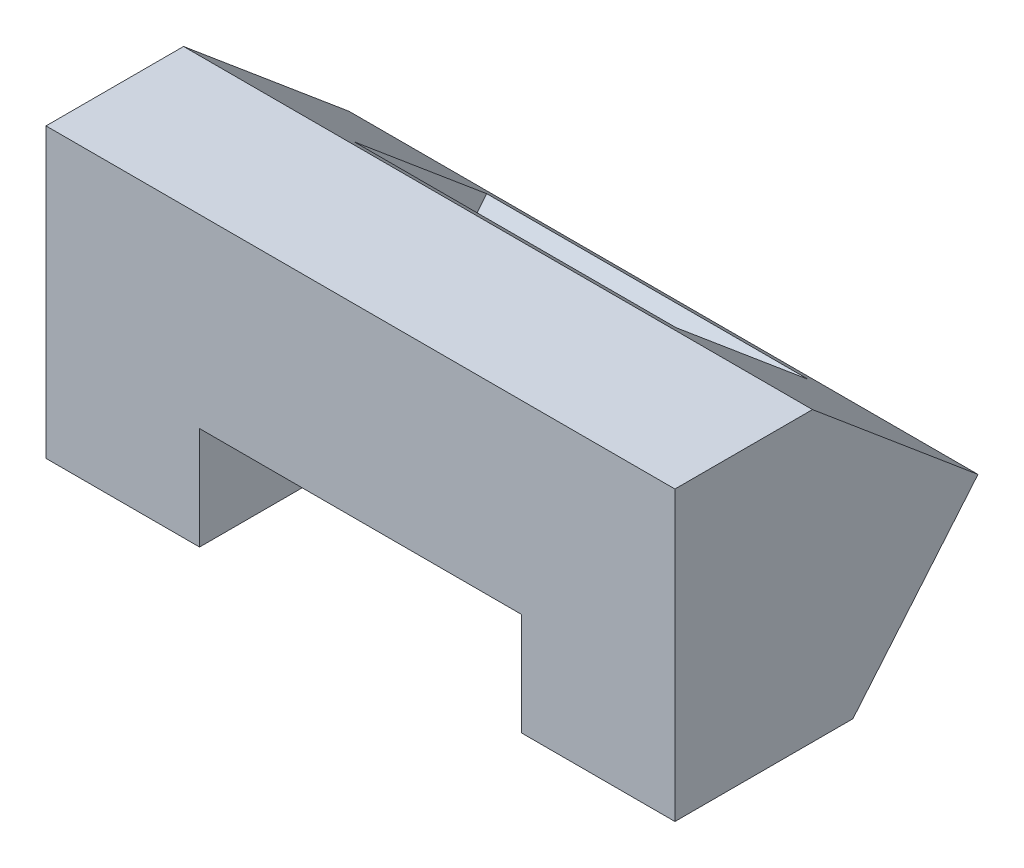
ISO-10303-21;
HEADER;
FILE_DESCRIPTION(('STEP AP214'),'2;1');
FILE_NAME('part.step','',(''),(''),'','','');
FILE_SCHEMA(('AUTOMOTIVE_DESIGN { 1 0 10303 214 1 1 1 1 }'));
ENDSEC;
DATA;
#1=APPLICATION_CONTEXT('core data for automotive mechanical design processes');
#2=APPLICATION_PROTOCOL_DEFINITION('international standard','automotive_design',2000,#1);
#3=PRODUCT_CONTEXT('',#1,'mechanical');
#4=PRODUCT('Part','Part','',(#3));
#5=PRODUCT_RELATED_PRODUCT_CATEGORY('part','',(#4));
#6=PRODUCT_DEFINITION_FORMATION('','',#4);
#7=PRODUCT_DEFINITION_CONTEXT('part definition',#1,'design');
#8=PRODUCT_DEFINITION('design','',#6,#7);
#9=PRODUCT_DEFINITION_SHAPE('','',#8);
#10=(LENGTH_UNIT() NAMED_UNIT(*) SI_UNIT(.MILLI.,.METRE.));
#11=(NAMED_UNIT(*) PLANE_ANGLE_UNIT() SI_UNIT($,.RADIAN.));
#12=(NAMED_UNIT(*) SI_UNIT($,.STERADIAN.) SOLID_ANGLE_UNIT());
#13=UNCERTAINTY_MEASURE_WITH_UNIT(LENGTH_MEASURE(1.E-05),#10,'distance_accuracy_value','');
#14=(GEOMETRIC_REPRESENTATION_CONTEXT(3) GLOBAL_UNCERTAINTY_ASSIGNED_CONTEXT((#13)) GLOBAL_UNIT_ASSIGNED_CONTEXT((#10,
#11,#12)) REPRESENTATION_CONTEXT('',''));
#15=CARTESIAN_POINT('',(0.,0.,0.));
#16=DIRECTION('',(0.,0.,1.));
#17=DIRECTION('',(1.,0.,0.));
#18=AXIS2_PLACEMENT_3D('',#15,#16,#17);
#19=CARTESIAN_POINT('',(0.,-125.337063400701,105.170283672372));
#20=DIRECTION('',(0.,0.766044443118977,-0.642787609686541));
#21=DIRECTION('',(0.,0.642787609686541,0.766044443118977));
#22=AXIS2_PLACEMENT_3D('',#19,#20,#21);
#23=PLANE('',#22);
#24=DIRECTION('',(-1.,0.,0.));
#25=VECTOR('',#24,1.);
#26=CARTESIAN_POINT('',(15.0384797227754,-227.995738018972,-17.1735606149134));
#27=LINE('',#26,#25);
#28=CARTESIAN_POINT('',(6.6,-227.995738018972,-17.1735606149134));
#29=VERTEX_POINT('',#28);
#30=CARTESIAN_POINT('',(-6.6,-227.995738018972,-17.1735606149134));
#31=VERTEX_POINT('',#30);
#32=EDGE_CURVE('E223',#29,#31,#27,.T.);
#33=ORIENTED_EDGE('',*,*,#32,.T.);
#34=DIRECTION('',(0.,-0.642787609686541,-0.766044443118977));
#35=VECTOR('',#34,1.);
#36=CARTESIAN_POINT('',(-6.6,-227.031556604443,-16.024493950235));
#37=LINE('',#36,#35);
#38=CARTESIAN_POINT('',(-6.6,-227.031556604443,-16.024493950235));
#39=VERTEX_POINT('',#38);
#40=EDGE_CURVE('E186',#39,#31,#37,.T.);
#41=ORIENTED_EDGE('',*,*,#40,.F.);
#42=DIRECTION('',(1.,0.,0.));
#43=VECTOR('',#42,1.);
#44=CARTESIAN_POINT('',(6.6,-227.031556604443,-16.024493950235));
#45=LINE('',#44,#43);
#46=CARTESIAN_POINT('',(6.6,-227.031556604443,-16.024493950235));
#47=VERTEX_POINT('',#46);
#48=EDGE_CURVE('E243',#39,#47,#45,.T.);
#49=ORIENTED_EDGE('',*,*,#48,.T.);
#50=DIRECTION('',(0.,-0.642787609686541,-0.766044443118977));
#51=VECTOR('',#50,1.);
#52=CARTESIAN_POINT('',(6.6,-227.031556604443,-16.024493950235));
#53=LINE('',#52,#51);
#54=EDGE_CURVE('E237',#47,#29,#53,.T.);
#55=ORIENTED_EDGE('',*,*,#54,.T.);
#56=EDGE_LOOP('',(#33,#41,#49,#55));
#57=FACE_BOUND('',#56,.T.);
#58=ADVANCED_FACE('F41',(#57),#23,.T.);
#59=CARTESIAN_POINT('',(12.9,-221.441619494967,-19.4748711922345));
#60=DIRECTION('',(1.,0.,0.));
#61=DIRECTION('',(0.,0.,-1.));
#62=AXIS2_PLACEMENT_3D('',#59,#60,#61);
#63=PLANE('',#62);
#64=DIRECTION('',(0.,-0.766044443118984,0.642787609686532));
#65=VECTOR('',#64,1.);
#66=CARTESIAN_POINT('',(12.9,-227.239033665489,-26.2283879750248));
#67=LINE('',#66,#65);
#68=CARTESIAN_POINT('',(12.9,-227.239033665489,-26.2283879750248));
#69=VERTEX_POINT('',#68);
#70=CARTESIAN_POINT('',(12.9,-233.355049167522,-21.0964416229947));
#71=VERTEX_POINT('',#70);
#72=EDGE_CURVE('E256',#69,#71,#67,.T.);
#73=ORIENTED_EDGE('',*,*,#72,.F.);
#74=DIRECTION('',(0.,-0.642787609686541,-0.766044443118977));
#75=VECTOR('',#74,1.);
#76=CARTESIAN_POINT('',(12.9,-221.541619494967,-19.4384741688079));
#77=LINE('',#76,#75);
#78=CARTESIAN_POINT('',(12.9,-221.541619494967,-19.4384741688079));
#79=VERTEX_POINT('',#78);
#80=EDGE_CURVE('E260',#79,#69,#77,.T.);
#81=ORIENTED_EDGE('',*,*,#80,.F.);
#82=DIRECTION('',(0.,0.,-1.));
#83=VECTOR('',#82,1.);
#84=CARTESIAN_POINT('',(12.9,-221.541619494967,-13.7962354342487));
#85=LINE('',#84,#83);
#86=CARTESIAN_POINT('',(12.9,-221.541619494967,-13.7962354342487));
#87=VERTEX_POINT('',#86);
#88=EDGE_CURVE('E264',#87,#79,#85,.T.);
#89=ORIENTED_EDGE('',*,*,#88,.F.);
#90=DIRECTION('',(0.,1.,0.));
#91=VECTOR('',#90,1.);
#92=CARTESIAN_POINT('',(12.9,-233.355049167522,-13.7962354342487));
#93=LINE('',#92,#91);
#94=CARTESIAN_POINT('',(12.9,-233.355049167522,-13.7962354342487));
#95=VERTEX_POINT('',#94);
#96=EDGE_CURVE('E268',#95,#87,#93,.T.);
#97=ORIENTED_EDGE('',*,*,#96,.F.);
#98=DIRECTION('',(0.,0.,1.));
#99=VECTOR('',#98,1.);
#100=CARTESIAN_POINT('',(12.9,-233.355049167522,-21.0964416229947));
#101=LINE('',#100,#99);
#102=EDGE_CURVE('E251',#71,#95,#101,.T.);
#103=ORIENTED_EDGE('',*,*,#102,.F.);
#104=EDGE_LOOP('',(#73,#81,#89,#97,#103));
#105=FACE_BOUND('',#104,.T.);
#106=ADVANCED_FACE('F43',(#105),#63,.T.);
#107=CARTESIAN_POINT('',(30.1497970082891,-233.355049167522,-21.0964416229947));
#108=DIRECTION('',(0.,-1.,0.));
#109=DIRECTION('',(0.,0.,-1.));
#110=AXIS2_PLACEMENT_3D('',#107,#108,#109);
#111=PLANE('',#110);
#112=DIRECTION('',(0.,0.,1.));
#113=VECTOR('',#112,1.);
#114=CARTESIAN_POINT('',(6.6,-233.355049167522,-13.7962354342487));
#115=LINE('',#114,#113);
#116=CARTESIAN_POINT('',(6.6,-233.355049167522,-19.3501614171714));
#117=VERTEX_POINT('',#116);
#118=CARTESIAN_POINT('',(6.6,-233.355049167522,-13.7962354342487));
#119=VERTEX_POINT('',#118);
#120=EDGE_CURVE('E161',#117,#119,#115,.T.);
#121=ORIENTED_EDGE('',*,*,#120,.F.);
#122=DIRECTION('',(-1.,0.,0.));
#123=VECTOR('',#122,1.);
#124=CARTESIAN_POINT('',(15.0384797227754,-233.355049167522,-19.3501614171714));
#125=LINE('',#124,#123);
#126=CARTESIAN_POINT('',(-6.6,-233.355049167522,-19.3501614171714));
#127=VERTEX_POINT('',#126);
#128=EDGE_CURVE('E155',#117,#127,#125,.T.);
#129=ORIENTED_EDGE('',*,*,#128,.T.);
#130=DIRECTION('',(0.,0.,1.));
#131=VECTOR('',#130,1.);
#132=CARTESIAN_POINT('',(-6.6,-233.355049167522,-13.7962354342487));
#133=LINE('',#132,#131);
#134=CARTESIAN_POINT('',(-6.6,-233.355049167522,-13.7962354342487));
#135=VERTEX_POINT('',#134);
#136=EDGE_CURVE('E159',#127,#135,#133,.T.);
#137=ORIENTED_EDGE('',*,*,#136,.T.);
#138=DIRECTION('',(1.,0.,0.));
#139=VECTOR('',#138,1.);
#140=CARTESIAN_POINT('',(-30.1497970082891,-233.355049167522,-13.7962354342487));
#141=LINE('',#140,#139);
#142=CARTESIAN_POINT('',(-12.9,-233.355049167522,-13.7962354342487));
#143=VERTEX_POINT('',#142);
#144=EDGE_CURVE('E203',#143,#135,#141,.T.);
#145=ORIENTED_EDGE('',*,*,#144,.F.);
#146=DIRECTION('',(0.,0.,1.));
#147=VECTOR('',#146,1.);
#148=CARTESIAN_POINT('',(-12.9,-233.355049167522,-21.0964416229947));
#149=LINE('',#148,#147);
#150=CARTESIAN_POINT('',(-12.9,-233.355049167522,-21.0964416229947));
#151=VERTEX_POINT('',#150);
#152=EDGE_CURVE('E198',#151,#143,#149,.T.);
#153=ORIENTED_EDGE('',*,*,#152,.F.);
#154=DIRECTION('',(-1.,0.,0.));
#155=VECTOR('',#154,1.);
#156=CARTESIAN_POINT('',(30.1497970082891,-233.355049167522,-21.0964416229947));
#157=LINE('',#156,#155);
#158=EDGE_CURVE('E49',#71,#151,#157,.T.);
#159=ORIENTED_EDGE('',*,*,#158,.F.);
#160=ORIENTED_EDGE('',*,*,#102,.T.);
#161=DIRECTION('',(-1.,0.,0.));
#162=VECTOR('',#161,1.);
#163=CARTESIAN_POINT('',(30.1497970082891,-233.355049167522,-13.7962354342487));
#164=LINE('',#163,#162);
#165=EDGE_CURVE('E255',#95,#119,#164,.T.);
#166=ORIENTED_EDGE('',*,*,#165,.T.);
#167=EDGE_LOOP('',(#121,#129,#137,#145,#153,#159,#160,#166));
#168=FACE_BOUND('',#167,.T.);
#169=ADVANCED_FACE('F157',(#168),#111,.T.);
#170=CARTESIAN_POINT('',(30.1497970082891,-233.355049167522,-13.7962354342487));
#171=DIRECTION('',(0.,0.,1.));
#172=DIRECTION('',(1.,0.,0.));
#173=AXIS2_PLACEMENT_3D('',#170,#171,#172);
#174=PLANE('',#173);
#175=DIRECTION('',(0.,1.,0.));
#176=VECTOR('',#175,1.);
#177=CARTESIAN_POINT('',(6.6,-229.144804683651,-13.7962354342487));
#178=LINE('',#177,#176);
#179=CARTESIAN_POINT('',(6.6,-229.144804683651,-13.7962354342487));
#180=VERTEX_POINT('',#179);
#181=EDGE_CURVE('E228',#119,#180,#178,.T.);
#182=ORIENTED_EDGE('',*,*,#181,.F.);
#183=ORIENTED_EDGE('',*,*,#165,.F.);
#184=ORIENTED_EDGE('',*,*,#96,.T.);
#185=DIRECTION('',(-1.,0.,0.));
#186=VECTOR('',#185,1.);
#187=CARTESIAN_POINT('',(30.1497970082891,-221.541619494967,-13.7962354342487));
#188=LINE('',#187,#186);
#189=CARTESIAN_POINT('',(-12.9,-221.541619494967,-13.7962354342487));
#190=VERTEX_POINT('',#189);
#191=EDGE_CURVE('E267',#87,#190,#188,.T.);
#192=ORIENTED_EDGE('',*,*,#191,.T.);
#193=DIRECTION('',(0.,1.,0.));
#194=VECTOR('',#193,1.);
#195=CARTESIAN_POINT('',(-12.9,-233.355049167522,-13.7962354342487));
#196=LINE('',#195,#194);
#197=EDGE_CURVE('E213',#143,#190,#196,.T.);
#198=ORIENTED_EDGE('',*,*,#197,.F.);
#199=ORIENTED_EDGE('',*,*,#144,.T.);
#200=DIRECTION('',(0.,1.,0.));
#201=VECTOR('',#200,1.);
#202=CARTESIAN_POINT('',(-6.6,-229.144804683651,-13.7962354342487));
#203=LINE('',#202,#201);
#204=CARTESIAN_POINT('',(-6.6,-229.144804683651,-13.7962354342487));
#205=VERTEX_POINT('',#204);
#206=EDGE_CURVE('E179',#135,#205,#203,.T.);
#207=ORIENTED_EDGE('',*,*,#206,.T.);
#208=DIRECTION('',(-1.,0.,0.));
#209=VECTOR('',#208,1.);
#210=CARTESIAN_POINT('',(15.0384797227754,-229.144804683651,-13.7962354342487));
#211=LINE('',#210,#209);
#212=EDGE_CURVE('E227',#180,#205,#211,.T.);
#213=ORIENTED_EDGE('',*,*,#212,.F.);
#214=EDGE_LOOP('',(#182,#183,#184,#192,#198,#199,#207,#213));
#215=FACE_BOUND('',#214,.T.);
#216=ADVANCED_FACE('F293',(#215),#174,.T.);
#217=CARTESIAN_POINT('',(30.1497970082891,-221.541619494967,-13.7962354342487));
#218=DIRECTION('',(0.,1.,0.));
#219=DIRECTION('',(0.,0.,1.));
#220=AXIS2_PLACEMENT_3D('',#217,#218,#219);
#221=PLANE('',#220);
#222=ORIENTED_EDGE('',*,*,#191,.F.);
#223=ORIENTED_EDGE('',*,*,#88,.T.);
#224=DIRECTION('',(-1.,0.,0.));
#225=VECTOR('',#224,1.);
#226=CARTESIAN_POINT('',(30.1497970082891,-221.541619494967,-19.4384741688079));
#227=LINE('',#226,#225);
#228=CARTESIAN_POINT('',(-12.9,-221.541619494967,-19.4384741688079));
#229=VERTEX_POINT('',#228);
#230=EDGE_CURVE('E263',#79,#229,#227,.T.);
#231=ORIENTED_EDGE('',*,*,#230,.T.);
#232=DIRECTION('',(0.,0.,-1.));
#233=VECTOR('',#232,1.);
#234=CARTESIAN_POINT('',(-12.9,-221.541619494967,-13.7962354342487));
#235=LINE('',#234,#233);
#236=EDGE_CURVE('E210',#190,#229,#235,.T.);
#237=ORIENTED_EDGE('',*,*,#236,.F.);
#238=EDGE_LOOP('',(#222,#223,#231,#237));
#239=FACE_BOUND('',#238,.T.);
#240=ADVANCED_FACE('F352',(#239),#221,.T.);
#241=CARTESIAN_POINT('',(30.1497970082891,-221.541619494967,-19.4384741688079));
#242=DIRECTION('',(0.,0.766044443118977,-0.642787609686541));
#243=DIRECTION('',(0.,0.642787609686541,0.766044443118977));
#244=AXIS2_PLACEMENT_3D('',#241,#242,#243);
#245=PLANE('',#244);
#246=DIRECTION('',(1.,0.,0.));
#247=VECTOR('',#246,1.);
#248=CARTESIAN_POINT('',(30.1497970082891,-222.128872168481,-20.1383346522289));
#249=LINE('',#248,#247);
#250=CARTESIAN_POINT('',(-6.6,-222.128872168481,-20.1383346522288));
#251=VERTEX_POINT('',#250);
#252=CARTESIAN_POINT('',(6.6,-222.128872168481,-20.1383346522288));
#253=VERTEX_POINT('',#252);
#254=EDGE_CURVE('E11',#251,#253,#249,.T.);
#255=ORIENTED_EDGE('',*,*,#254,.F.);
#256=DIRECTION('',(0.,-0.642787609686541,-0.766044443118977));
#257=VECTOR('',#256,1.);
#258=CARTESIAN_POINT('',(-6.6,-222.128872168481,-20.1383346522288));
#259=LINE('',#258,#257);
#260=CARTESIAN_POINT('',(-6.6,-226.692664197256,-25.5772501983736));
#261=VERTEX_POINT('',#260);
#262=EDGE_CURVE('E191',#251,#261,#259,.T.);
#263=ORIENTED_EDGE('',*,*,#262,.T.);
#264=DIRECTION('',(-1.,0.,0.));
#265=VECTOR('',#264,1.);
#266=CARTESIAN_POINT('',(6.6,-226.692664197256,-25.5772501983735));
#267=LINE('',#266,#265);
#268=CARTESIAN_POINT('',(6.6,-226.692664197256,-25.5772501983736));
#269=VERTEX_POINT('',#268);
#270=EDGE_CURVE('E247',#269,#261,#267,.T.);
#271=ORIENTED_EDGE('',*,*,#270,.F.);
#272=DIRECTION('',(0.,-0.642787609686541,-0.766044443118977));
#273=VECTOR('',#272,1.);
#274=CARTESIAN_POINT('',(6.6,-222.128872168481,-20.1383346522288));
#275=LINE('',#274,#273);
#276=EDGE_CURVE('E63',#253,#269,#275,.T.);
#277=ORIENTED_EDGE('',*,*,#276,.F.);
#278=EDGE_LOOP('',(#255,#263,#271,#277));
#279=FACE_BOUND('',#278,.T.);
#280=DIRECTION('',(0.,-0.642787609686541,-0.766044443118977));
#281=VECTOR('',#280,1.);
#282=CARTESIAN_POINT('',(-12.9,-221.541619494967,-19.4384741688079));
#283=LINE('',#282,#281);
#284=CARTESIAN_POINT('',(-12.9,-227.239033665489,-26.2283879750248));
#285=VERTEX_POINT('',#284);
#286=EDGE_CURVE('E207',#229,#285,#283,.T.);
#287=ORIENTED_EDGE('',*,*,#286,.F.);
#288=ORIENTED_EDGE('',*,*,#230,.F.);
#289=ORIENTED_EDGE('',*,*,#80,.T.);
#290=DIRECTION('',(-1.,0.,0.));
#291=VECTOR('',#290,1.);
#292=CARTESIAN_POINT('',(30.1497970082891,-227.239033665489,-26.2283879750248));
#293=LINE('',#292,#291);
#294=EDGE_CURVE('E259',#69,#285,#293,.T.);
#295=ORIENTED_EDGE('',*,*,#294,.T.);
#296=EDGE_LOOP('',(#287,#288,#289,#295));
#297=FACE_BOUND('',#296,.T.);
#298=ADVANCED_FACE('F287',(#279,#297),#245,.T.);
#299=CARTESIAN_POINT('',(30.1497970082891,-227.239033665489,-26.2283879750248));
#300=DIRECTION('',(0.,-0.642787609686532,-0.766044443118984));
#301=DIRECTION('',(0.,0.766044443118984,-0.642787609686532));
#302=AXIS2_PLACEMENT_3D('',#299,#300,#301);
#303=PLANE('',#302);
#304=ORIENTED_EDGE('',*,*,#294,.F.);
#305=ORIENTED_EDGE('',*,*,#72,.T.);
#306=ORIENTED_EDGE('',*,*,#158,.T.);
#307=DIRECTION('',(0.,-0.766044443118984,0.642787609686532));
#308=VECTOR('',#307,1.);
#309=CARTESIAN_POINT('',(-12.9,-227.239033665489,-26.2283879750248));
#310=LINE('',#309,#308);
#311=EDGE_CURVE('E204',#285,#151,#310,.T.);
#312=ORIENTED_EDGE('',*,*,#311,.F.);
#313=EDGE_LOOP('',(#304,#305,#306,#312));
#314=FACE_BOUND('',#313,.T.);
#315=ADVANCED_FACE('F279',(#314),#303,.T.);
#316=DIRECTION('',(-1.,0.,0.));
#317=VECTOR('',#316,1.);
#318=CARTESIAN_POINT('',(15.0384797227754,-230.631167218687,-20.3143428317012));
#319=LINE('',#318,#317);
#320=CARTESIAN_POINT('',(6.6,-230.631167218687,-20.3143428317012));
#321=VERTEX_POINT('',#320);
#322=CARTESIAN_POINT('',(-6.6,-230.631167218687,-20.3143428317012));
#323=VERTEX_POINT('',#322);
#324=EDGE_CURVE('E221',#321,#323,#319,.T.);
#325=ORIENTED_EDGE('',*,*,#324,.F.);
#326=CARTESIAN_POINT('',(6.6,-231.595348633217,-21.4634094963797));
#327=VERTEX_POINT('',#326);
#328=EDGE_CURVE('E241',#321,#327,#53,.T.);
#329=ORIENTED_EDGE('',*,*,#328,.T.);
#330=DIRECTION('',(-1.,0.,0.));
#331=VECTOR('',#330,1.);
#332=CARTESIAN_POINT('',(6.6,-231.595348633217,-21.4634094963797));
#333=LINE('',#332,#331);
#334=CARTESIAN_POINT('',(-6.6,-231.595348633217,-21.4634094963797));
#335=VERTEX_POINT('',#334);
#336=EDGE_CURVE('E240',#327,#335,#333,.T.);
#337=ORIENTED_EDGE('',*,*,#336,.T.);
#338=EDGE_CURVE('E190',#323,#335,#37,.T.);
#339=ORIENTED_EDGE('',*,*,#338,.F.);
#340=EDGE_LOOP('',(#325,#329,#337,#339));
#341=FACE_BOUND('',#340,.T.);
#342=ADVANCED_FACE('F325',(#341),#23,.T.);
#343=CARTESIAN_POINT('',(6.6,-227.031556604443,-16.024493950235));
#344=DIRECTION('',(0.,0.642787609686541,0.766044443118977));
#345=DIRECTION('',(0.,-0.766044443118977,0.642787609686541));
#346=AXIS2_PLACEMENT_3D('',#343,#344,#345);
#347=PLANE('',#346);
#348=ORIENTED_EDGE('',*,*,#254,.T.);
#349=DIRECTION('',(0.,0.766044443118977,-0.642787609686541));
#350=VECTOR('',#349,1.);
#351=CARTESIAN_POINT('',(6.6,-227.031556604443,-16.024493950235));
#352=LINE('',#351,#350);
#353=EDGE_CURVE('E249',#47,#253,#352,.T.);
#354=ORIENTED_EDGE('',*,*,#353,.F.);
#355=ORIENTED_EDGE('',*,*,#48,.F.);
#356=DIRECTION('',(0.,0.766044443118977,-0.642787609686541));
#357=VECTOR('',#356,1.);
#358=CARTESIAN_POINT('',(-6.6,-227.031556604443,-16.024493950235));
#359=LINE('',#358,#357);
#360=EDGE_CURVE('E195',#39,#251,#359,.T.);
#361=ORIENTED_EDGE('',*,*,#360,.T.);
#362=EDGE_LOOP('',(#348,#354,#355,#361));
#363=FACE_BOUND('',#362,.T.);
#364=ADVANCED_FACE('F327',(#363),#347,.F.);
#365=CARTESIAN_POINT('',(6.6,-231.595348633217,-21.4634094963797));
#366=DIRECTION('',(0.,-0.642787609686541,-0.766044443118977));
#367=DIRECTION('',(0.,0.766044443118977,-0.642787609686541));
#368=AXIS2_PLACEMENT_3D('',#365,#366,#367);
#369=PLANE('',#368);
#370=ORIENTED_EDGE('',*,*,#336,.F.);
#371=DIRECTION('',(0.,0.766044443118977,-0.642787609686541));
#372=VECTOR('',#371,1.);
#373=CARTESIAN_POINT('',(6.6,-231.595348633217,-21.4634094963797));
#374=LINE('',#373,#372);
#375=EDGE_CURVE('E245',#327,#269,#374,.T.);
#376=ORIENTED_EDGE('',*,*,#375,.T.);
#377=ORIENTED_EDGE('',*,*,#270,.T.);
#378=DIRECTION('',(0.,0.766044443118977,-0.642787609686541));
#379=VECTOR('',#378,1.);
#380=CARTESIAN_POINT('',(-6.6,-231.595348633217,-21.4634094963797));
#381=LINE('',#380,#379);
#382=EDGE_CURVE('E189',#335,#261,#381,.T.);
#383=ORIENTED_EDGE('',*,*,#382,.F.);
#384=EDGE_LOOP('',(#370,#376,#377,#383));
#385=FACE_BOUND('',#384,.T.);
#386=ADVANCED_FACE('F323',(#385),#369,.F.);
#387=CARTESIAN_POINT('',(6.6,-227.031556604443,-16.024493950235));
#388=DIRECTION('',(1.,0.,0.));
#389=DIRECTION('',(0.,0.,-1.));
#390=AXIS2_PLACEMENT_3D('',#387,#388,#389);
#391=PLANE('',#390);
#392=ORIENTED_EDGE('',*,*,#276,.T.);
#393=ORIENTED_EDGE('',*,*,#375,.F.);
#394=ORIENTED_EDGE('',*,*,#328,.F.);
#395=DIRECTION('',(0.,-0.766044443118983,0.642787609686533));
#396=VECTOR('',#395,1.);
#397=CARTESIAN_POINT('',(6.6,-231.780233883366,-19.3501614171714));
#398=LINE('',#397,#396);
#399=CARTESIAN_POINT('',(6.6,-231.780233883366,-19.3501614171714));
#400=VERTEX_POINT('',#399);
#401=EDGE_CURVE('E218',#321,#400,#398,.T.);
#402=ORIENTED_EDGE('',*,*,#401,.T.);
#403=DIRECTION('',(0.,-1.,0.));
#404=VECTOR('',#403,1.);
#405=CARTESIAN_POINT('',(6.6,-233.355049167522,-19.3501614171714));
#406=LINE('',#405,#404);
#407=EDGE_CURVE('E164',#400,#117,#406,.T.);
#408=ORIENTED_EDGE('',*,*,#407,.T.);
#409=ORIENTED_EDGE('',*,*,#120,.T.);
#410=ORIENTED_EDGE('',*,*,#181,.T.);
#411=DIRECTION('',(0.,0.,-1.));
#412=VECTOR('',#411,1.);
#413=CARTESIAN_POINT('',(6.6,-229.144804683651,-16.2093792003836));
#414=LINE('',#413,#412);
#415=CARTESIAN_POINT('',(6.6,-229.144804683651,-16.2093792003836));
#416=VERTEX_POINT('',#415);
#417=EDGE_CURVE('E225',#180,#416,#414,.T.);
#418=ORIENTED_EDGE('',*,*,#417,.T.);
#419=DIRECTION('',(0.,0.76604444311897,-0.642787609686549));
#420=VECTOR('',#419,1.);
#421=CARTESIAN_POINT('',(6.6,-227.995738018972,-17.1735606149134));
#422=LINE('',#421,#420);
#423=EDGE_CURVE('E56',#416,#29,#422,.T.);
#424=ORIENTED_EDGE('',*,*,#423,.T.);
#425=ORIENTED_EDGE('',*,*,#54,.F.);
#426=ORIENTED_EDGE('',*,*,#353,.T.);
#427=EDGE_LOOP('',(#392,#393,#394,#402,#408,#409,#410,#418,#424,#425,#426));
#428=FACE_BOUND('',#427,.T.);
#429=ADVANCED_FACE('F295',(#428),#391,.F.);
#430=CARTESIAN_POINT('',(15.0384797227754,-233.355049167522,-19.3501614171714));
#431=DIRECTION('',(0.,0.,-1.));
#432=DIRECTION('',(-1.,0.,0.));
#433=AXIS2_PLACEMENT_3D('',#430,#431,#432);
#434=PLANE('',#433);
#435=DIRECTION('',(-1.,0.,0.));
#436=VECTOR('',#435,1.);
#437=CARTESIAN_POINT('',(15.0384797227754,-231.780233883366,-19.3501614171714));
#438=LINE('',#437,#436);
#439=CARTESIAN_POINT('',(-6.6,-231.780233883366,-19.3501614171714));
#440=VERTEX_POINT('',#439);
#441=EDGE_CURVE('E170',#400,#440,#438,.T.);
#442=ORIENTED_EDGE('',*,*,#441,.T.);
#443=DIRECTION('',(0.,-1.,0.));
#444=VECTOR('',#443,1.);
#445=CARTESIAN_POINT('',(-6.6,-233.355049167522,-19.3501614171714));
#446=LINE('',#445,#444);
#447=EDGE_CURVE('E167',#440,#127,#446,.T.);
#448=ORIENTED_EDGE('',*,*,#447,.T.);
#449=ORIENTED_EDGE('',*,*,#128,.F.);
#450=ORIENTED_EDGE('',*,*,#407,.F.);
#451=EDGE_LOOP('',(#442,#448,#449,#450));
#452=FACE_BOUND('',#451,.T.);
#453=ADVANCED_FACE('F168',(#452),#434,.F.);
#454=CARTESIAN_POINT('',(15.0384797227754,-229.144804683651,-16.2093792003836));
#455=DIRECTION('',(0.,1.,0.));
#456=DIRECTION('',(0.,0.,1.));
#457=AXIS2_PLACEMENT_3D('',#454,#455,#456);
#458=PLANE('',#457);
#459=ORIENTED_EDGE('',*,*,#212,.T.);
#460=DIRECTION('',(0.,0.,-1.));
#461=VECTOR('',#460,1.);
#462=CARTESIAN_POINT('',(-6.6,-229.144804683651,-16.2093792003836));
#463=LINE('',#462,#461);
#464=CARTESIAN_POINT('',(-6.6,-229.144804683651,-16.2093792003836));
#465=VERTEX_POINT('',#464);
#466=EDGE_CURVE('E182',#205,#465,#463,.T.);
#467=ORIENTED_EDGE('',*,*,#466,.T.);
#468=DIRECTION('',(-1.,0.,0.));
#469=VECTOR('',#468,1.);
#470=CARTESIAN_POINT('',(15.0384797227754,-229.144804683651,-16.2093792003836));
#471=LINE('',#470,#469);
#472=EDGE_CURVE('E224',#416,#465,#471,.T.);
#473=ORIENTED_EDGE('',*,*,#472,.F.);
#474=ORIENTED_EDGE('',*,*,#417,.F.);
#475=EDGE_LOOP('',(#459,#467,#473,#474));
#476=FACE_BOUND('',#475,.T.);
#477=ADVANCED_FACE('F310',(#476),#458,.F.);
#478=CARTESIAN_POINT('',(15.0384797227754,-227.995738018972,-17.1735606149134));
#479=DIRECTION('',(0.,0.642787609686549,0.76604444311897));
#480=DIRECTION('',(0.,-0.76604444311897,0.642787609686549));
#481=AXIS2_PLACEMENT_3D('',#478,#479,#480);
#482=PLANE('',#481);
#483=ORIENTED_EDGE('',*,*,#472,.T.);
#484=DIRECTION('',(0.,0.76604444311897,-0.642787609686549));
#485=VECTOR('',#484,1.);
#486=CARTESIAN_POINT('',(-6.6,-227.995738018972,-17.1735606149134));
#487=LINE('',#486,#485);
#488=EDGE_CURVE('E302',#465,#31,#487,.T.);
#489=ORIENTED_EDGE('',*,*,#488,.T.);
#490=ORIENTED_EDGE('',*,*,#32,.F.);
#491=ORIENTED_EDGE('',*,*,#423,.F.);
#492=EDGE_LOOP('',(#483,#489,#490,#491));
#493=FACE_BOUND('',#492,.T.);
#494=ADVANCED_FACE('F314',(#493),#482,.F.);
#495=CARTESIAN_POINT('',(15.0384797227754,-231.780233883366,-19.3501614171714));
#496=DIRECTION('',(0.,-0.642787609686533,-0.766044443118983));
#497=DIRECTION('',(0.,0.766044443118983,-0.642787609686533));
#498=AXIS2_PLACEMENT_3D('',#495,#496,#497);
#499=PLANE('',#498);
#500=ORIENTED_EDGE('',*,*,#324,.T.);
#501=DIRECTION('',(0.,-0.766044443118983,0.642787609686533));
#502=VECTOR('',#501,1.);
#503=CARTESIAN_POINT('',(-6.6,-231.780233883366,-19.3501614171714));
#504=LINE('',#503,#502);
#505=EDGE_CURVE('E194',#323,#440,#504,.T.);
#506=ORIENTED_EDGE('',*,*,#505,.T.);
#507=ORIENTED_EDGE('',*,*,#441,.F.);
#508=ORIENTED_EDGE('',*,*,#401,.F.);
#509=EDGE_LOOP('',(#500,#506,#507,#508));
#510=FACE_BOUND('',#509,.T.);
#511=ADVANCED_FACE('F299',(#510),#499,.F.);
#512=CARTESIAN_POINT('',(-12.9,-221.441619494967,-19.4748711922345));
#513=DIRECTION('',(-1.,0.,0.));
#514=DIRECTION('',(0.,0.,-1.));
#515=AXIS2_PLACEMENT_3D('',#512,#513,#514);
#516=PLANE('',#515);
#517=ORIENTED_EDGE('',*,*,#311,.T.);
#518=ORIENTED_EDGE('',*,*,#152,.T.);
#519=ORIENTED_EDGE('',*,*,#197,.T.);
#520=ORIENTED_EDGE('',*,*,#236,.T.);
#521=ORIENTED_EDGE('',*,*,#286,.T.);
#522=EDGE_LOOP('',(#517,#518,#519,#520,#521));
#523=FACE_BOUND('',#522,.T.);
#524=ADVANCED_FACE('F282',(#523),#516,.T.);
#525=CARTESIAN_POINT('',(-6.6,-227.031556604443,-16.024493950235));
#526=DIRECTION('',(-1.,0.,0.));
#527=DIRECTION('',(0.,0.,-1.));
#528=AXIS2_PLACEMENT_3D('',#525,#526,#527);
#529=PLANE('',#528);
#530=ORIENTED_EDGE('',*,*,#262,.F.);
#531=ORIENTED_EDGE('',*,*,#360,.F.);
#532=ORIENTED_EDGE('',*,*,#40,.T.);
#533=ORIENTED_EDGE('',*,*,#488,.F.);
#534=ORIENTED_EDGE('',*,*,#466,.F.);
#535=ORIENTED_EDGE('',*,*,#206,.F.);
#536=ORIENTED_EDGE('',*,*,#136,.F.);
#537=ORIENTED_EDGE('',*,*,#447,.F.);
#538=ORIENTED_EDGE('',*,*,#505,.F.);
#539=ORIENTED_EDGE('',*,*,#338,.T.);
#540=ORIENTED_EDGE('',*,*,#382,.T.);
#541=EDGE_LOOP('',(#530,#531,#532,#533,#534,#535,#536,#537,#538,#539,#540));
#542=FACE_BOUND('',#541,.T.);
#543=ADVANCED_FACE('F176',(#542),#529,.F.);
#544=CLOSED_SHELL('',(#58,#106,#169,#216,#240,#298,#315,#342,#364,#386,#429,#453,#477,#494,#511,
#524,#543));
#545=MANIFOLD_SOLID_BREP('B2',#544);
#546=ADVANCED_BREP_SHAPE_REPRESENTATION('',(#18,#545),#14);
#547=SHAPE_DEFINITION_REPRESENTATION(#9,#546);
ENDSEC;
END-ISO-10303-21;
